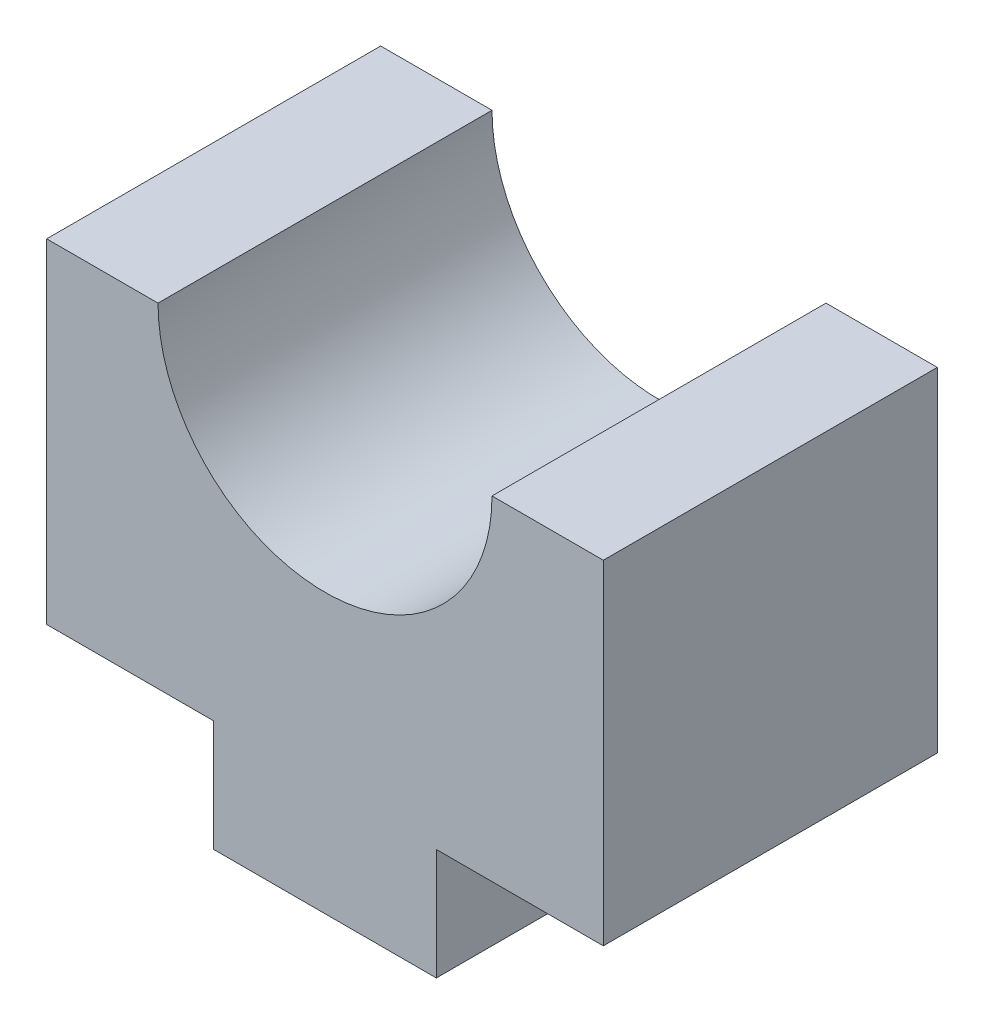
ISO-10303-21;
HEADER;
FILE_DESCRIPTION(('STEP AP214'),'2;1');
FILE_NAME('part.step','',(''),(''),'','','');
FILE_SCHEMA(('AUTOMOTIVE_DESIGN { 1 0 10303 214 1 1 1 1 }'));
ENDSEC;
DATA;
#1=APPLICATION_CONTEXT('core data for automotive mechanical design processes');
#2=APPLICATION_PROTOCOL_DEFINITION('international standard','automotive_design',2000,#1);
#3=PRODUCT_CONTEXT('',#1,'mechanical');
#4=PRODUCT('Part','Part','',(#3));
#5=PRODUCT_RELATED_PRODUCT_CATEGORY('part','',(#4));
#6=PRODUCT_DEFINITION_FORMATION('','',#4);
#7=PRODUCT_DEFINITION_CONTEXT('part definition',#1,'design');
#8=PRODUCT_DEFINITION('design','',#6,#7);
#9=PRODUCT_DEFINITION_SHAPE('','',#8);
#10=(LENGTH_UNIT() NAMED_UNIT(*) SI_UNIT(.MILLI.,.METRE.));
#11=(NAMED_UNIT(*) PLANE_ANGLE_UNIT() SI_UNIT($,.RADIAN.));
#12=(NAMED_UNIT(*) SI_UNIT($,.STERADIAN.) SOLID_ANGLE_UNIT());
#13=UNCERTAINTY_MEASURE_WITH_UNIT(LENGTH_MEASURE(1.E-05),#10,'distance_accuracy_value','');
#14=(GEOMETRIC_REPRESENTATION_CONTEXT(3) GLOBAL_UNCERTAINTY_ASSIGNED_CONTEXT((#13)) GLOBAL_UNIT_ASSIGNED_CONTEXT((#10,
#11,#12)) REPRESENTATION_CONTEXT('',''));
#15=CARTESIAN_POINT('',(0.,0.,0.));
#16=DIRECTION('',(0.,0.,1.));
#17=DIRECTION('',(1.,0.,0.));
#18=AXIS2_PLACEMENT_3D('',#15,#16,#17);
#19=CARTESIAN_POINT('',(0.,5.,-15.));
#20=DIRECTION('',(1.,0.,0.));
#21=DIRECTION('',(0.,0.,-1.));
#22=AXIS2_PLACEMENT_3D('',#19,#20,#21);
#23=PLANE('',#22);
#24=DIRECTION('',(0.,1.,0.));
#25=VECTOR('',#24,1.);
#26=CARTESIAN_POINT('',(0.,5.,0.));
#27=LINE('',#26,#25);
#28=CARTESIAN_POINT('',(0.,0.,0.));
#29=VERTEX_POINT('',#28);
#30=CARTESIAN_POINT('',(0.,5.,0.));
#31=VERTEX_POINT('',#30);
#32=EDGE_CURVE('E154',#29,#31,#27,.T.);
#33=ORIENTED_EDGE('',*,*,#32,.F.);
#34=DIRECTION('',(0.,0.,1.));
#35=VECTOR('',#34,1.);
#36=CARTESIAN_POINT('',(0.,0.,-15.));
#37=LINE('',#36,#35);
#38=CARTESIAN_POINT('',(0.,0.,-15.));
#39=VERTEX_POINT('',#38);
#40=EDGE_CURVE('E11',#39,#29,#37,.T.);
#41=ORIENTED_EDGE('',*,*,#40,.F.);
#42=DIRECTION('',(0.,1.,0.));
#43=VECTOR('',#42,1.);
#44=CARTESIAN_POINT('',(0.,5.,-15.));
#45=LINE('',#44,#43);
#46=CARTESIAN_POINT('',(0.,5.,-15.));
#47=VERTEX_POINT('',#46);
#48=EDGE_CURVE('E190',#39,#47,#45,.T.);
#49=ORIENTED_EDGE('',*,*,#48,.T.);
#50=DIRECTION('',(0.,0.,1.));
#51=VECTOR('',#50,1.);
#52=CARTESIAN_POINT('',(0.,5.,-15.));
#53=LINE('',#52,#51);
#54=EDGE_CURVE('E42',#47,#31,#53,.T.);
#55=ORIENTED_EDGE('',*,*,#54,.T.);
#56=EDGE_LOOP('',(#33,#41,#49,#55));
#57=FACE_BOUND('',#56,.T.);
#58=ADVANCED_FACE('F39',(#57),#23,.T.);
#59=CARTESIAN_POINT('',(0.,0.,-15.));
#60=DIRECTION('',(0.,-1.,0.));
#61=DIRECTION('',(0.,0.,-1.));
#62=AXIS2_PLACEMENT_3D('',#59,#60,#61);
#63=PLANE('',#62);
#64=DIRECTION('',(1.,0.,0.));
#65=VECTOR('',#64,1.);
#66=CARTESIAN_POINT('',(0.,0.,0.));
#67=LINE('',#66,#65);
#68=CARTESIAN_POINT('',(-10.,0.,0.));
#69=VERTEX_POINT('',#68);
#70=EDGE_CURVE('E187',#69,#29,#67,.T.);
#71=ORIENTED_EDGE('',*,*,#70,.F.);
#72=DIRECTION('',(0.,0.,1.));
#73=VECTOR('',#72,1.);
#74=CARTESIAN_POINT('',(-10.,0.,-15.));
#75=LINE('',#74,#73);
#76=CARTESIAN_POINT('',(-10.,0.,-15.));
#77=VERTEX_POINT('',#76);
#78=EDGE_CURVE('E49',#77,#69,#75,.T.);
#79=ORIENTED_EDGE('',*,*,#78,.F.);
#80=DIRECTION('',(1.,0.,0.));
#81=VECTOR('',#80,1.);
#82=CARTESIAN_POINT('',(0.,0.,-15.));
#83=LINE('',#82,#81);
#84=EDGE_CURVE('E140',#77,#39,#83,.T.);
#85=ORIENTED_EDGE('',*,*,#84,.T.);
#86=ORIENTED_EDGE('',*,*,#40,.T.);
#87=EDGE_LOOP('',(#71,#79,#85,#86));
#88=FACE_BOUND('',#87,.T.);
#89=ADVANCED_FACE('F214',(#88),#63,.T.);
#90=CARTESIAN_POINT('',(-10.,0.,-15.));
#91=DIRECTION('',(-1.,0.,0.));
#92=DIRECTION('',(0.,0.,1.));
#93=AXIS2_PLACEMENT_3D('',#90,#91,#92);
#94=PLANE('',#93);
#95=DIRECTION('',(0.,-1.,0.));
#96=VECTOR('',#95,1.);
#97=CARTESIAN_POINT('',(-10.,0.,0.));
#98=LINE('',#97,#96);
#99=CARTESIAN_POINT('',(-10.,5.,0.));
#100=VERTEX_POINT('',#99);
#101=EDGE_CURVE('E126',#100,#69,#98,.T.);
#102=ORIENTED_EDGE('',*,*,#101,.F.);
#103=DIRECTION('',(0.,0.,1.));
#104=VECTOR('',#103,1.);
#105=CARTESIAN_POINT('',(-10.,5.,-15.));
#106=LINE('',#105,#104);
#107=CARTESIAN_POINT('',(-10.,5.,-15.));
#108=VERTEX_POINT('',#107);
#109=EDGE_CURVE('E121',#108,#100,#106,.T.);
#110=ORIENTED_EDGE('',*,*,#109,.F.);
#111=DIRECTION('',(0.,-1.,0.));
#112=VECTOR('',#111,1.);
#113=CARTESIAN_POINT('',(-10.,0.,-15.));
#114=LINE('',#113,#112);
#115=EDGE_CURVE('E124',#108,#77,#114,.T.);
#116=ORIENTED_EDGE('',*,*,#115,.T.);
#117=ORIENTED_EDGE('',*,*,#78,.T.);
#118=EDGE_LOOP('',(#102,#110,#116,#117));
#119=FACE_BOUND('',#118,.T.);
#120=ADVANCED_FACE('F123',(#119),#94,.T.);
#121=CARTESIAN_POINT('',(-10.,5.,-15.));
#122=DIRECTION('',(0.,-1.,0.));
#123=DIRECTION('',(1.,0.,0.));
#124=AXIS2_PLACEMENT_3D('',#121,#122,#123);
#125=PLANE('',#124);
#126=DIRECTION('',(1.,0.,0.));
#127=VECTOR('',#126,1.);
#128=CARTESIAN_POINT('',(-10.,5.,0.));
#129=LINE('',#128,#127);
#130=CARTESIAN_POINT('',(-17.5,5.,0.));
#131=VERTEX_POINT('',#130);
#132=EDGE_CURVE('E182',#131,#100,#129,.T.);
#133=ORIENTED_EDGE('',*,*,#132,.F.);
#134=DIRECTION('',(0.,0.,1.));
#135=VECTOR('',#134,1.);
#136=CARTESIAN_POINT('',(-17.5,5.,-15.));
#137=LINE('',#136,#135);
#138=CARTESIAN_POINT('',(-17.5,5.,-15.));
#139=VERTEX_POINT('',#138);
#140=EDGE_CURVE('E132',#139,#131,#137,.T.);
#141=ORIENTED_EDGE('',*,*,#140,.F.);
#142=DIRECTION('',(1.,0.,0.));
#143=VECTOR('',#142,1.);
#144=CARTESIAN_POINT('',(-10.,5.,-15.));
#145=LINE('',#144,#143);
#146=EDGE_CURVE('E138',#139,#108,#145,.T.);
#147=ORIENTED_EDGE('',*,*,#146,.T.);
#148=ORIENTED_EDGE('',*,*,#109,.T.);
#149=EDGE_LOOP('',(#133,#141,#147,#148));
#150=FACE_BOUND('',#149,.T.);
#151=ADVANCED_FACE('F143',(#150),#125,.T.);
#152=CARTESIAN_POINT('',(-17.5,5.,-15.));
#153=DIRECTION('',(-1.,0.,0.));
#154=DIRECTION('',(0.,-1.,0.));
#155=AXIS2_PLACEMENT_3D('',#152,#153,#154);
#156=PLANE('',#155);
#157=DIRECTION('',(0.,-1.,0.));
#158=VECTOR('',#157,1.);
#159=CARTESIAN_POINT('',(-17.5,5.,0.));
#160=LINE('',#159,#158);
#161=CARTESIAN_POINT('',(-17.5,20.,0.));
#162=VERTEX_POINT('',#161);
#163=EDGE_CURVE('E178',#162,#131,#160,.T.);
#164=ORIENTED_EDGE('',*,*,#163,.F.);
#165=DIRECTION('',(0.,0.,1.));
#166=VECTOR('',#165,1.);
#167=CARTESIAN_POINT('',(-17.5,20.,-15.));
#168=LINE('',#167,#166);
#169=CARTESIAN_POINT('',(-17.5,20.,-15.));
#170=VERTEX_POINT('',#169);
#171=EDGE_CURVE('E196',#170,#162,#168,.T.);
#172=ORIENTED_EDGE('',*,*,#171,.F.);
#173=DIRECTION('',(0.,-1.,0.));
#174=VECTOR('',#173,1.);
#175=CARTESIAN_POINT('',(-17.5,5.,-15.));
#176=LINE('',#175,#174);
#177=EDGE_CURVE('E145',#170,#139,#176,.T.);
#178=ORIENTED_EDGE('',*,*,#177,.T.);
#179=ORIENTED_EDGE('',*,*,#140,.T.);
#180=EDGE_LOOP('',(#164,#172,#178,#179));
#181=FACE_BOUND('',#180,.T.);
#182=ADVANCED_FACE('F227',(#181),#156,.T.);
#183=CARTESIAN_POINT('',(-17.5,20.,-15.));
#184=DIRECTION('',(0.,1.,0.));
#185=DIRECTION('',(0.,0.,1.));
#186=AXIS2_PLACEMENT_3D('',#183,#184,#185);
#187=PLANE('',#186);
#188=DIRECTION('',(-1.,0.,0.));
#189=VECTOR('',#188,1.);
#190=CARTESIAN_POINT('',(-17.5,20.,0.));
#191=LINE('',#190,#189);
#192=CARTESIAN_POINT('',(-12.5,20.,0.));
#193=VERTEX_POINT('',#192);
#194=EDGE_CURVE('E174',#193,#162,#191,.T.);
#195=ORIENTED_EDGE('',*,*,#194,.F.);
#196=DIRECTION('',(0.,0.,1.));
#197=VECTOR('',#196,1.);
#198=CARTESIAN_POINT('',(-12.5,20.,-15.));
#199=LINE('',#198,#197);
#200=CARTESIAN_POINT('',(-12.5,20.,-15.));
#201=VERTEX_POINT('',#200);
#202=EDGE_CURVE('E199',#201,#193,#199,.T.);
#203=ORIENTED_EDGE('',*,*,#202,.F.);
#204=DIRECTION('',(-1.,0.,0.));
#205=VECTOR('',#204,1.);
#206=CARTESIAN_POINT('',(-17.5,20.,-15.));
#207=LINE('',#206,#205);
#208=EDGE_CURVE('E148',#201,#170,#207,.T.);
#209=ORIENTED_EDGE('',*,*,#208,.T.);
#210=ORIENTED_EDGE('',*,*,#171,.T.);
#211=EDGE_LOOP('',(#195,#203,#209,#210));
#212=FACE_BOUND('',#211,.T.);
#213=ADVANCED_FACE('F230',(#212),#187,.T.);
#214=CARTESIAN_POINT('',(-5.,20.,-15.));
#215=DIRECTION('',(0.,0.,1.));
#216=DIRECTION('',(1.,0.,0.));
#217=AXIS2_PLACEMENT_3D('',#214,#215,#216);
#218=CYLINDRICAL_SURFACE('',#217,7.5);
#219=CARTESIAN_POINT('',(-5.,20.,0.));
#220=DIRECTION('',(0.,0.,-1.));
#221=DIRECTION('',(1.,0.,0.));
#222=AXIS2_PLACEMENT_3D('',#219,#220,#221);
#223=CIRCLE('',#222,7.5);
#224=CARTESIAN_POINT('',(2.5,20.,0.));
#225=VERTEX_POINT('',#224);
#226=EDGE_CURVE('E170',#225,#193,#223,.T.);
#227=ORIENTED_EDGE('',*,*,#226,.F.);
#228=DIRECTION('',(0.,0.,1.));
#229=VECTOR('',#228,1.);
#230=CARTESIAN_POINT('',(2.5,20.,-15.));
#231=LINE('',#230,#229);
#232=CARTESIAN_POINT('',(2.5,20.,-15.));
#233=VERTEX_POINT('',#232);
#234=EDGE_CURVE('E202',#233,#225,#231,.T.);
#235=ORIENTED_EDGE('',*,*,#234,.F.);
#236=CARTESIAN_POINT('',(-5.,20.,-15.));
#237=DIRECTION('',(0.,0.,-1.));
#238=DIRECTION('',(1.,0.,0.));
#239=AXIS2_PLACEMENT_3D('',#236,#237,#238);
#240=CIRCLE('',#239,7.5);
#241=EDGE_CURVE('E329',#233,#201,#240,.T.);
#242=ORIENTED_EDGE('',*,*,#241,.T.);
#243=ORIENTED_EDGE('',*,*,#202,.T.);
#244=EDGE_LOOP('',(#227,#235,#242,#243));
#245=FACE_BOUND('',#244,.T.);
#246=ADVANCED_FACE('F234',(#245),#218,.F.);
#247=CARTESIAN_POINT('',(2.5,20.,-15.));
#248=DIRECTION('',(0.,1.,0.));
#249=DIRECTION('',(0.,0.,1.));
#250=AXIS2_PLACEMENT_3D('',#247,#248,#249);
#251=PLANE('',#250);
#252=DIRECTION('',(-1.,0.,0.));
#253=VECTOR('',#252,1.);
#254=CARTESIAN_POINT('',(2.5,20.,0.));
#255=LINE('',#254,#253);
#256=CARTESIAN_POINT('',(7.5,20.,0.));
#257=VERTEX_POINT('',#256);
#258=EDGE_CURVE('E166',#257,#225,#255,.T.);
#259=ORIENTED_EDGE('',*,*,#258,.F.);
#260=DIRECTION('',(0.,0.,1.));
#261=VECTOR('',#260,1.);
#262=CARTESIAN_POINT('',(7.5,20.,-15.));
#263=LINE('',#262,#261);
#264=CARTESIAN_POINT('',(7.5,20.,-15.));
#265=VERTEX_POINT('',#264);
#266=EDGE_CURVE('E205',#265,#257,#263,.T.);
#267=ORIENTED_EDGE('',*,*,#266,.F.);
#268=DIRECTION('',(-1.,0.,0.));
#269=VECTOR('',#268,1.);
#270=CARTESIAN_POINT('',(2.5,20.,-15.));
#271=LINE('',#270,#269);
#272=EDGE_CURVE('E325',#265,#233,#271,.T.);
#273=ORIENTED_EDGE('',*,*,#272,.T.);
#274=ORIENTED_EDGE('',*,*,#234,.T.);
#275=EDGE_LOOP('',(#259,#267,#273,#274));
#276=FACE_BOUND('',#275,.T.);
#277=ADVANCED_FACE('F238',(#276),#251,.T.);
#278=CARTESIAN_POINT('',(7.5,20.,-15.));
#279=DIRECTION('',(1.,0.,0.));
#280=DIRECTION('',(0.,1.,0.));
#281=AXIS2_PLACEMENT_3D('',#278,#279,#280);
#282=PLANE('',#281);
#283=DIRECTION('',(0.,1.,0.));
#284=VECTOR('',#283,1.);
#285=CARTESIAN_POINT('',(7.5,20.,0.));
#286=LINE('',#285,#284);
#287=CARTESIAN_POINT('',(7.5,5.,0.));
#288=VERTEX_POINT('',#287);
#289=EDGE_CURVE('E162',#288,#257,#286,.T.);
#290=ORIENTED_EDGE('',*,*,#289,.F.);
#291=DIRECTION('',(0.,0.,1.));
#292=VECTOR('',#291,1.);
#293=CARTESIAN_POINT('',(7.5,5.,-15.));
#294=LINE('',#293,#292);
#295=CARTESIAN_POINT('',(7.5,5.,-15.));
#296=VERTEX_POINT('',#295);
#297=EDGE_CURVE('E207',#296,#288,#294,.T.);
#298=ORIENTED_EDGE('',*,*,#297,.F.);
#299=DIRECTION('',(0.,1.,0.));
#300=VECTOR('',#299,1.);
#301=CARTESIAN_POINT('',(7.5,20.,-15.));
#302=LINE('',#301,#300);
#303=EDGE_CURVE('E339',#296,#265,#302,.T.);
#304=ORIENTED_EDGE('',*,*,#303,.T.);
#305=ORIENTED_EDGE('',*,*,#266,.T.);
#306=EDGE_LOOP('',(#290,#298,#304,#305));
#307=FACE_BOUND('',#306,.T.);
#308=ADVANCED_FACE('F242',(#307),#282,.T.);
#309=CARTESIAN_POINT('',(7.5,5.,-15.));
#310=DIRECTION('',(0.,-1.,0.));
#311=DIRECTION('',(1.,0.,0.));
#312=AXIS2_PLACEMENT_3D('',#309,#310,#311);
#313=PLANE('',#312);
#314=DIRECTION('',(1.,0.,0.));
#315=VECTOR('',#314,1.);
#316=CARTESIAN_POINT('',(7.5,5.,0.));
#317=LINE('',#316,#315);
#318=EDGE_CURVE('E158',#31,#288,#317,.T.);
#319=ORIENTED_EDGE('',*,*,#318,.F.);
#320=ORIENTED_EDGE('',*,*,#54,.F.);
#321=DIRECTION('',(1.,0.,0.));
#322=VECTOR('',#321,1.);
#323=CARTESIAN_POINT('',(7.5,5.,-15.));
#324=LINE('',#323,#322);
#325=EDGE_CURVE('E342',#47,#296,#324,.T.);
#326=ORIENTED_EDGE('',*,*,#325,.T.);
#327=ORIENTED_EDGE('',*,*,#297,.T.);
#328=EDGE_LOOP('',(#319,#320,#326,#327));
#329=FACE_BOUND('',#328,.T.);
#330=ADVANCED_FACE('F211',(#329),#313,.T.);
#331=CARTESIAN_POINT('',(-5.,20.,-15.));
#332=DIRECTION('',(0.,0.,1.));
#333=DIRECTION('',(1.,0.,0.));
#334=AXIS2_PLACEMENT_3D('',#331,#332,#333);
#335=PLANE('',#334);
#336=ORIENTED_EDGE('',*,*,#48,.F.);
#337=ORIENTED_EDGE('',*,*,#84,.F.);
#338=ORIENTED_EDGE('',*,*,#115,.F.);
#339=ORIENTED_EDGE('',*,*,#146,.F.);
#340=ORIENTED_EDGE('',*,*,#177,.F.);
#341=ORIENTED_EDGE('',*,*,#208,.F.);
#342=ORIENTED_EDGE('',*,*,#241,.F.);
#343=ORIENTED_EDGE('',*,*,#272,.F.);
#344=ORIENTED_EDGE('',*,*,#303,.F.);
#345=ORIENTED_EDGE('',*,*,#325,.F.);
#346=EDGE_LOOP('',(#336,#337,#338,#339,#340,#341,#342,#343,#344,#345));
#347=FACE_BOUND('',#346,.T.);
#348=ADVANCED_FACE('F136',(#347),#335,.F.);
#349=CARTESIAN_POINT('',(-5.,20.,0.));
#350=DIRECTION('',(0.,0.,1.));
#351=DIRECTION('',(1.,0.,0.));
#352=AXIS2_PLACEMENT_3D('',#349,#350,#351);
#353=PLANE('',#352);
#354=ORIENTED_EDGE('',*,*,#32,.T.);
#355=ORIENTED_EDGE('',*,*,#318,.T.);
#356=ORIENTED_EDGE('',*,*,#289,.T.);
#357=ORIENTED_EDGE('',*,*,#258,.T.);
#358=ORIENTED_EDGE('',*,*,#226,.T.);
#359=ORIENTED_EDGE('',*,*,#194,.T.);
#360=ORIENTED_EDGE('',*,*,#163,.T.);
#361=ORIENTED_EDGE('',*,*,#132,.T.);
#362=ORIENTED_EDGE('',*,*,#101,.T.);
#363=ORIENTED_EDGE('',*,*,#70,.T.);
#364=EDGE_LOOP('',(#354,#355,#356,#357,#358,#359,#360,#361,#362,#363));
#365=FACE_BOUND('',#364,.T.);
#366=ADVANCED_FACE('F213',(#365),#353,.T.);
#367=CLOSED_SHELL('',(#58,#89,#120,#151,#182,#213,#246,#277,#308,#330,#348,#366));
#368=MANIFOLD_SOLID_BREP('B2',#367);
#369=ADVANCED_BREP_SHAPE_REPRESENTATION('',(#18,#368),#14);
#370=SHAPE_DEFINITION_REPRESENTATION(#9,#369);
ENDSEC;
END-ISO-10303-21;
